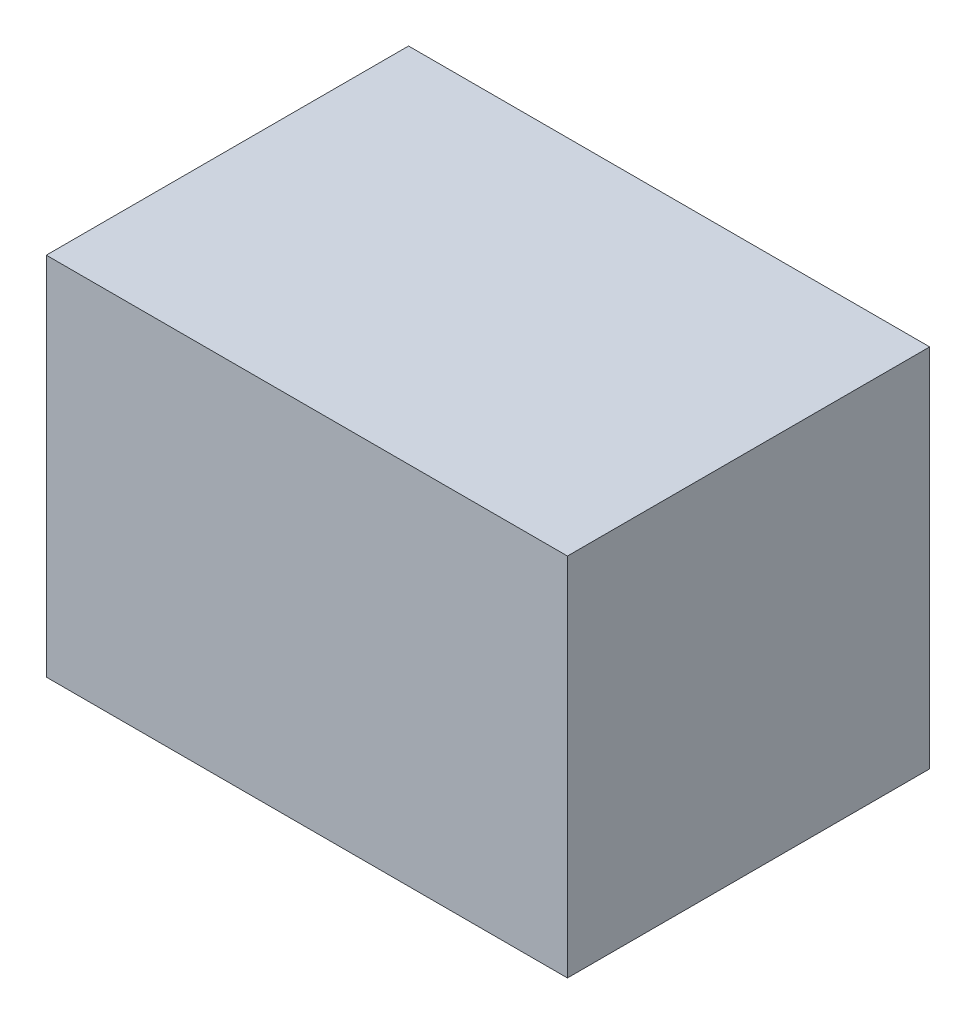
ISO-10303-21;
HEADER;
FILE_DESCRIPTION(('STEP AP214'),'2;1');
FILE_NAME('part.step','',(''),(''),'','','');
FILE_SCHEMA(('AUTOMOTIVE_DESIGN { 1 0 10303 214 1 1 1 1 }'));
ENDSEC;
DATA;
#1=APPLICATION_CONTEXT('core data for automotive mechanical design processes');
#2=APPLICATION_PROTOCOL_DEFINITION('international standard','automotive_design',2000,#1);
#3=PRODUCT_CONTEXT('',#1,'mechanical');
#4=PRODUCT('Part','Part','',(#3));
#5=PRODUCT_RELATED_PRODUCT_CATEGORY('part','',(#4));
#6=PRODUCT_DEFINITION_FORMATION('','',#4);
#7=PRODUCT_DEFINITION_CONTEXT('part definition',#1,'design');
#8=PRODUCT_DEFINITION('design','',#6,#7);
#9=PRODUCT_DEFINITION_SHAPE('','',#8);
#10=(LENGTH_UNIT() NAMED_UNIT(*) SI_UNIT(.MILLI.,.METRE.));
#11=(NAMED_UNIT(*) PLANE_ANGLE_UNIT() SI_UNIT($,.RADIAN.));
#12=(NAMED_UNIT(*) SI_UNIT($,.STERADIAN.) SOLID_ANGLE_UNIT());
#13=UNCERTAINTY_MEASURE_WITH_UNIT(LENGTH_MEASURE(1.E-05),#10,'distance_accuracy_value','');
#14=(GEOMETRIC_REPRESENTATION_CONTEXT(3) GLOBAL_UNCERTAINTY_ASSIGNED_CONTEXT((#13)) GLOBAL_UNIT_ASSIGNED_CONTEXT((#10,
#11,#12)) REPRESENTATION_CONTEXT('',''));
#15=CARTESIAN_POINT('',(0.,0.,0.));
#16=DIRECTION('',(0.,0.,1.));
#17=DIRECTION('',(1.,0.,0.));
#18=AXIS2_PLACEMENT_3D('',#15,#16,#17);
#19=CARTESIAN_POINT('',(8.2,11.5,-5.7));
#20=DIRECTION('',(-1.,0.,0.));
#21=DIRECTION('',(0.,0.,1.));
#22=AXIS2_PLACEMENT_3D('',#19,#20,#21);
#23=PLANE('',#22);
#24=DIRECTION('',(0.,0.,-1.));
#25=VECTOR('',#24,1.);
#26=CARTESIAN_POINT('',(8.2,0.,-5.7));
#27=LINE('',#26,#25);
#28=CARTESIAN_POINT('',(8.2,0.,5.7));
#29=VERTEX_POINT('',#28);
#30=CARTESIAN_POINT('',(8.2,0.,-5.7));
#31=VERTEX_POINT('',#30);
#32=EDGE_CURVE('E100',#29,#31,#27,.T.);
#33=ORIENTED_EDGE('',*,*,#32,.T.);
#34=DIRECTION('',(0.,-1.,0.));
#35=VECTOR('',#34,1.);
#36=CARTESIAN_POINT('',(8.2,11.5,-5.7));
#37=LINE('',#36,#35);
#38=CARTESIAN_POINT('',(8.2,11.5,-5.7));
#39=VERTEX_POINT('',#38);
#40=EDGE_CURVE('E11',#39,#31,#37,.T.);
#41=ORIENTED_EDGE('',*,*,#40,.F.);
#42=DIRECTION('',(0.,0.,-1.));
#43=VECTOR('',#42,1.);
#44=CARTESIAN_POINT('',(8.2,11.5,-5.7));
#45=LINE('',#44,#43);
#46=CARTESIAN_POINT('',(8.2,11.5,5.7));
#47=VERTEX_POINT('',#46);
#48=EDGE_CURVE('E88',#47,#39,#45,.T.);
#49=ORIENTED_EDGE('',*,*,#48,.F.);
#50=DIRECTION('',(0.,-1.,0.));
#51=VECTOR('',#50,1.);
#52=CARTESIAN_POINT('',(8.2,11.5,5.7));
#53=LINE('',#52,#51);
#54=EDGE_CURVE('E96',#47,#29,#53,.T.);
#55=ORIENTED_EDGE('',*,*,#54,.T.);
#56=EDGE_LOOP('',(#33,#41,#49,#55));
#57=FACE_BOUND('',#56,.T.);
#58=ADVANCED_FACE('F37',(#57),#23,.F.);
#59=CARTESIAN_POINT('',(-8.2,11.5,-5.7));
#60=DIRECTION('',(0.,0.,1.));
#61=DIRECTION('',(1.,0.,0.));
#62=AXIS2_PLACEMENT_3D('',#59,#60,#61);
#63=PLANE('',#62);
#64=DIRECTION('',(-1.,0.,0.));
#65=VECTOR('',#64,1.);
#66=CARTESIAN_POINT('',(-8.2,0.,-5.7));
#67=LINE('',#66,#65);
#68=CARTESIAN_POINT('',(-8.2,0.,-5.7));
#69=VERTEX_POINT('',#68);
#70=EDGE_CURVE('E92',#31,#69,#67,.T.);
#71=ORIENTED_EDGE('',*,*,#70,.T.);
#72=DIRECTION('',(0.,-1.,0.));
#73=VECTOR('',#72,1.);
#74=CARTESIAN_POINT('',(-8.2,11.5,-5.7));
#75=LINE('',#74,#73);
#76=CARTESIAN_POINT('',(-8.2,11.5,-5.7));
#77=VERTEX_POINT('',#76);
#78=EDGE_CURVE('E45',#77,#69,#75,.T.);
#79=ORIENTED_EDGE('',*,*,#78,.F.);
#80=DIRECTION('',(-1.,0.,0.));
#81=VECTOR('',#80,1.);
#82=CARTESIAN_POINT('',(-8.2,11.5,-5.7));
#83=LINE('',#82,#81);
#84=EDGE_CURVE('E83',#39,#77,#83,.T.);
#85=ORIENTED_EDGE('',*,*,#84,.F.);
#86=ORIENTED_EDGE('',*,*,#40,.T.);
#87=EDGE_LOOP('',(#71,#79,#85,#86));
#88=FACE_BOUND('',#87,.T.);
#89=ADVANCED_FACE('F91',(#88),#63,.F.);
#90=CARTESIAN_POINT('',(-8.2,11.5,-5.7));
#91=DIRECTION('',(1.,0.,0.));
#92=DIRECTION('',(0.,0.,-1.));
#93=AXIS2_PLACEMENT_3D('',#90,#91,#92);
#94=PLANE('',#93);
#95=DIRECTION('',(0.,0.,1.));
#96=VECTOR('',#95,1.);
#97=CARTESIAN_POINT('',(-8.2,0.,-5.7));
#98=LINE('',#97,#96);
#99=CARTESIAN_POINT('',(-8.2,0.,5.7));
#100=VERTEX_POINT('',#99);
#101=EDGE_CURVE('E70',#69,#100,#98,.T.);
#102=ORIENTED_EDGE('',*,*,#101,.T.);
#103=DIRECTION('',(0.,-1.,0.));
#104=VECTOR('',#103,1.);
#105=CARTESIAN_POINT('',(-8.2,11.5,5.7));
#106=LINE('',#105,#104);
#107=CARTESIAN_POINT('',(-8.2,11.5,5.7));
#108=VERTEX_POINT('',#107);
#109=EDGE_CURVE('E93',#108,#100,#106,.T.);
#110=ORIENTED_EDGE('',*,*,#109,.F.);
#111=DIRECTION('',(0.,0.,1.));
#112=VECTOR('',#111,1.);
#113=CARTESIAN_POINT('',(-8.2,11.5,-5.7));
#114=LINE('',#113,#112);
#115=EDGE_CURVE('E86',#77,#108,#114,.T.);
#116=ORIENTED_EDGE('',*,*,#115,.F.);
#117=ORIENTED_EDGE('',*,*,#78,.T.);
#118=EDGE_LOOP('',(#102,#110,#116,#117));
#119=FACE_BOUND('',#118,.T.);
#120=ADVANCED_FACE('F94',(#119),#94,.F.);
#121=CARTESIAN_POINT('',(-8.2,11.5,5.7));
#122=DIRECTION('',(0.,0.,-1.));
#123=DIRECTION('',(-1.,0.,0.));
#124=AXIS2_PLACEMENT_3D('',#121,#122,#123);
#125=PLANE('',#124);
#126=DIRECTION('',(1.,0.,0.));
#127=VECTOR('',#126,1.);
#128=CARTESIAN_POINT('',(-8.2,0.,5.7));
#129=LINE('',#128,#127);
#130=EDGE_CURVE('E76',#100,#29,#129,.T.);
#131=ORIENTED_EDGE('',*,*,#130,.T.);
#132=ORIENTED_EDGE('',*,*,#54,.F.);
#133=DIRECTION('',(1.,0.,0.));
#134=VECTOR('',#133,1.);
#135=CARTESIAN_POINT('',(-8.2,11.5,5.7));
#136=LINE('',#135,#134);
#137=EDGE_CURVE('E53',#108,#47,#136,.T.);
#138=ORIENTED_EDGE('',*,*,#137,.F.);
#139=ORIENTED_EDGE('',*,*,#109,.T.);
#140=EDGE_LOOP('',(#131,#132,#138,#139));
#141=FACE_BOUND('',#140,.T.);
#142=ADVANCED_FACE('F107',(#141),#125,.F.);
#143=CARTESIAN_POINT('',(0.,11.5,0.));
#144=DIRECTION('',(0.,1.,0.));
#145=DIRECTION('',(0.,0.,1.));
#146=AXIS2_PLACEMENT_3D('',#143,#144,#145);
#147=PLANE('',#146);
#148=ORIENTED_EDGE('',*,*,#48,.T.);
#149=ORIENTED_EDGE('',*,*,#84,.T.);
#150=ORIENTED_EDGE('',*,*,#115,.T.);
#151=ORIENTED_EDGE('',*,*,#137,.T.);
#152=EDGE_LOOP('',(#148,#149,#150,#151));
#153=FACE_BOUND('',#152,.T.);
#154=ADVANCED_FACE('F84',(#153),#147,.T.);
#155=CARTESIAN_POINT('',(0.,0.,0.));
#156=DIRECTION('',(0.,1.,0.));
#157=DIRECTION('',(0.,0.,1.));
#158=AXIS2_PLACEMENT_3D('',#155,#156,#157);
#159=PLANE('',#158);
#160=ORIENTED_EDGE('',*,*,#32,.F.);
#161=ORIENTED_EDGE('',*,*,#130,.F.);
#162=ORIENTED_EDGE('',*,*,#101,.F.);
#163=ORIENTED_EDGE('',*,*,#70,.F.);
#164=EDGE_LOOP('',(#160,#161,#162,#163));
#165=FACE_BOUND('',#164,.T.);
#166=ADVANCED_FACE('F110',(#165),#159,.F.);
#167=CLOSED_SHELL('',(#58,#89,#120,#142,#154,#166));
#168=MANIFOLD_SOLID_BREP('B2',#167);
#169=ADVANCED_BREP_SHAPE_REPRESENTATION('',(#18,#168),#14);
#170=SHAPE_DEFINITION_REPRESENTATION(#9,#169);
ENDSEC;
END-ISO-10303-21;
